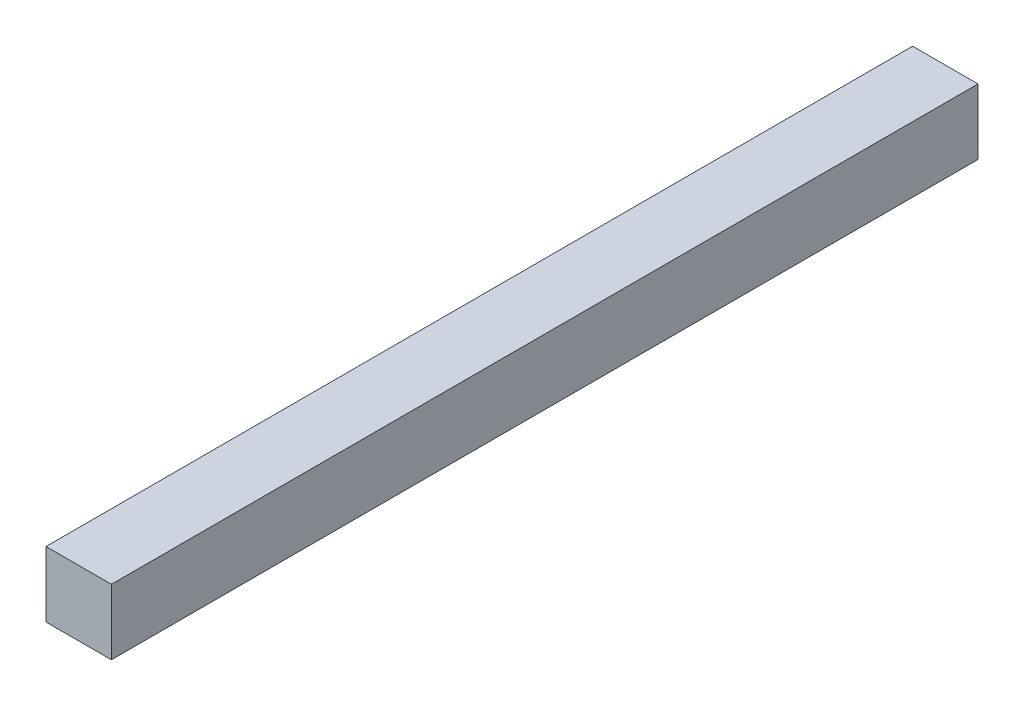
ISO-10303-21;
HEADER;
FILE_DESCRIPTION(('STEP AP214'),'2;1');
FILE_NAME('part.step','',(''),(''),'','','');
FILE_SCHEMA(('AUTOMOTIVE_DESIGN { 1 0 10303 214 1 1 1 1 }'));
ENDSEC;
DATA;
#1=APPLICATION_CONTEXT('core data for automotive mechanical design processes');
#2=APPLICATION_PROTOCOL_DEFINITION('international standard','automotive_design',2000,#1);
#3=PRODUCT_CONTEXT('',#1,'mechanical');
#4=PRODUCT('Part','Part','',(#3));
#5=PRODUCT_RELATED_PRODUCT_CATEGORY('part','',(#4));
#6=PRODUCT_DEFINITION_FORMATION('','',#4);
#7=PRODUCT_DEFINITION_CONTEXT('part definition',#1,'design');
#8=PRODUCT_DEFINITION('design','',#6,#7);
#9=PRODUCT_DEFINITION_SHAPE('','',#8);
#10=(LENGTH_UNIT() NAMED_UNIT(*) SI_UNIT(.MILLI.,.METRE.));
#11=(NAMED_UNIT(*) PLANE_ANGLE_UNIT() SI_UNIT($,.RADIAN.));
#12=(NAMED_UNIT(*) SI_UNIT($,.STERADIAN.) SOLID_ANGLE_UNIT());
#13=UNCERTAINTY_MEASURE_WITH_UNIT(LENGTH_MEASURE(1.E-05),#10,'distance_accuracy_value','');
#14=(GEOMETRIC_REPRESENTATION_CONTEXT(3) GLOBAL_UNCERTAINTY_ASSIGNED_CONTEXT((#13)) GLOBAL_UNIT_ASSIGNED_CONTEXT((#10,
#11,#12)) REPRESENTATION_CONTEXT('',''));
#15=CARTESIAN_POINT('',(0.,0.,0.));
#16=DIRECTION('',(0.,0.,1.));
#17=DIRECTION('',(1.,0.,0.));
#18=AXIS2_PLACEMENT_3D('',#15,#16,#17);
#19=CARTESIAN_POINT('',(10.,-10.,265.));
#20=DIRECTION('',(-1.,0.,0.));
#21=DIRECTION('',(0.,0.,1.));
#22=AXIS2_PLACEMENT_3D('',#19,#20,#21);
#23=PLANE('',#22);
#24=DIRECTION('',(0.,1.,0.));
#25=VECTOR('',#24,1.);
#26=CARTESIAN_POINT('',(10.,-10.,0.));
#27=LINE('',#26,#25);
#28=CARTESIAN_POINT('',(10.,-10.,0.));
#29=VERTEX_POINT('',#28);
#30=CARTESIAN_POINT('',(10.,10.,0.));
#31=VERTEX_POINT('',#30);
#32=EDGE_CURVE('E96',#29,#31,#27,.T.);
#33=ORIENTED_EDGE('',*,*,#32,.T.);
#34=DIRECTION('',(0.,0.,-1.));
#35=VECTOR('',#34,1.);
#36=CARTESIAN_POINT('',(10.,10.,265.));
#37=LINE('',#36,#35);
#38=CARTESIAN_POINT('',(10.,10.,265.));
#39=VERTEX_POINT('',#38);
#40=EDGE_CURVE('E11',#39,#31,#37,.T.);
#41=ORIENTED_EDGE('',*,*,#40,.F.);
#42=DIRECTION('',(0.,1.,0.));
#43=VECTOR('',#42,1.);
#44=CARTESIAN_POINT('',(10.,-10.,265.));
#45=LINE('',#44,#43);
#46=CARTESIAN_POINT('',(10.,-10.,265.));
#47=VERTEX_POINT('',#46);
#48=EDGE_CURVE('E84',#47,#39,#45,.T.);
#49=ORIENTED_EDGE('',*,*,#48,.F.);
#50=DIRECTION('',(0.,0.,-1.));
#51=VECTOR('',#50,1.);
#52=CARTESIAN_POINT('',(10.,-10.,265.));
#53=LINE('',#52,#51);
#54=EDGE_CURVE('E92',#47,#29,#53,.T.);
#55=ORIENTED_EDGE('',*,*,#54,.T.);
#56=EDGE_LOOP('',(#33,#41,#49,#55));
#57=FACE_BOUND('',#56,.T.);
#58=ADVANCED_FACE('F33',(#57),#23,.F.);
#59=CARTESIAN_POINT('',(-10.,10.,265.));
#60=DIRECTION('',(0.,-1.,0.));
#61=DIRECTION('',(0.,0.,-1.));
#62=AXIS2_PLACEMENT_3D('',#59,#60,#61);
#63=PLANE('',#62);
#64=DIRECTION('',(-1.,0.,0.));
#65=VECTOR('',#64,1.);
#66=CARTESIAN_POINT('',(-10.,10.,0.));
#67=LINE('',#66,#65);
#68=CARTESIAN_POINT('',(-10.,10.,0.));
#69=VERTEX_POINT('',#68);
#70=EDGE_CURVE('E88',#31,#69,#67,.T.);
#71=ORIENTED_EDGE('',*,*,#70,.T.);
#72=DIRECTION('',(0.,0.,-1.));
#73=VECTOR('',#72,1.);
#74=CARTESIAN_POINT('',(-10.,10.,265.));
#75=LINE('',#74,#73);
#76=CARTESIAN_POINT('',(-10.,10.,265.));
#77=VERTEX_POINT('',#76);
#78=EDGE_CURVE('E41',#77,#69,#75,.T.);
#79=ORIENTED_EDGE('',*,*,#78,.F.);
#80=DIRECTION('',(-1.,0.,0.));
#81=VECTOR('',#80,1.);
#82=CARTESIAN_POINT('',(-10.,10.,265.));
#83=LINE('',#82,#81);
#84=EDGE_CURVE('E79',#39,#77,#83,.T.);
#85=ORIENTED_EDGE('',*,*,#84,.F.);
#86=ORIENTED_EDGE('',*,*,#40,.T.);
#87=EDGE_LOOP('',(#71,#79,#85,#86));
#88=FACE_BOUND('',#87,.T.);
#89=ADVANCED_FACE('F87',(#88),#63,.F.);
#90=CARTESIAN_POINT('',(-10.,-10.,265.));
#91=DIRECTION('',(1.,0.,0.));
#92=DIRECTION('',(0.,0.,-1.));
#93=AXIS2_PLACEMENT_3D('',#90,#91,#92);
#94=PLANE('',#93);
#95=DIRECTION('',(0.,-1.,0.));
#96=VECTOR('',#95,1.);
#97=CARTESIAN_POINT('',(-10.,-10.,0.));
#98=LINE('',#97,#96);
#99=CARTESIAN_POINT('',(-10.,-10.,0.));
#100=VERTEX_POINT('',#99);
#101=EDGE_CURVE('E66',#69,#100,#98,.T.);
#102=ORIENTED_EDGE('',*,*,#101,.T.);
#103=DIRECTION('',(0.,0.,-1.));
#104=VECTOR('',#103,1.);
#105=CARTESIAN_POINT('',(-10.,-10.,265.));
#106=LINE('',#105,#104);
#107=CARTESIAN_POINT('',(-10.,-10.,265.));
#108=VERTEX_POINT('',#107);
#109=EDGE_CURVE('E89',#108,#100,#106,.T.);
#110=ORIENTED_EDGE('',*,*,#109,.F.);
#111=DIRECTION('',(0.,-1.,0.));
#112=VECTOR('',#111,1.);
#113=CARTESIAN_POINT('',(-10.,-10.,265.));
#114=LINE('',#113,#112);
#115=EDGE_CURVE('E82',#77,#108,#114,.T.);
#116=ORIENTED_EDGE('',*,*,#115,.F.);
#117=ORIENTED_EDGE('',*,*,#78,.T.);
#118=EDGE_LOOP('',(#102,#110,#116,#117));
#119=FACE_BOUND('',#118,.T.);
#120=ADVANCED_FACE('F90',(#119),#94,.F.);
#121=CARTESIAN_POINT('',(-10.,-10.,265.));
#122=DIRECTION('',(0.,1.,0.));
#123=DIRECTION('',(0.,0.,1.));
#124=AXIS2_PLACEMENT_3D('',#121,#122,#123);
#125=PLANE('',#124);
#126=DIRECTION('',(1.,0.,0.));
#127=VECTOR('',#126,1.);
#128=CARTESIAN_POINT('',(-10.,-10.,0.));
#129=LINE('',#128,#127);
#130=EDGE_CURVE('E72',#100,#29,#129,.T.);
#131=ORIENTED_EDGE('',*,*,#130,.T.);
#132=ORIENTED_EDGE('',*,*,#54,.F.);
#133=DIRECTION('',(1.,0.,0.));
#134=VECTOR('',#133,1.);
#135=CARTESIAN_POINT('',(-10.,-10.,265.));
#136=LINE('',#135,#134);
#137=EDGE_CURVE('E49',#108,#47,#136,.T.);
#138=ORIENTED_EDGE('',*,*,#137,.F.);
#139=ORIENTED_EDGE('',*,*,#109,.T.);
#140=EDGE_LOOP('',(#131,#132,#138,#139));
#141=FACE_BOUND('',#140,.T.);
#142=ADVANCED_FACE('F103',(#141),#125,.F.);
#143=CARTESIAN_POINT('',(0.,0.,265.));
#144=DIRECTION('',(0.,0.,-1.));
#145=DIRECTION('',(-1.,0.,0.));
#146=AXIS2_PLACEMENT_3D('',#143,#144,#145);
#147=PLANE('',#146);
#148=ORIENTED_EDGE('',*,*,#48,.T.);
#149=ORIENTED_EDGE('',*,*,#84,.T.);
#150=ORIENTED_EDGE('',*,*,#115,.T.);
#151=ORIENTED_EDGE('',*,*,#137,.T.);
#152=EDGE_LOOP('',(#148,#149,#150,#151));
#153=FACE_BOUND('',#152,.T.);
#154=ADVANCED_FACE('F80',(#153),#147,.F.);
#155=CARTESIAN_POINT('',(0.,0.,0.));
#156=DIRECTION('',(0.,0.,-1.));
#157=DIRECTION('',(-1.,0.,0.));
#158=AXIS2_PLACEMENT_3D('',#155,#156,#157);
#159=PLANE('',#158);
#160=ORIENTED_EDGE('',*,*,#32,.F.);
#161=ORIENTED_EDGE('',*,*,#130,.F.);
#162=ORIENTED_EDGE('',*,*,#101,.F.);
#163=ORIENTED_EDGE('',*,*,#70,.F.);
#164=EDGE_LOOP('',(#160,#161,#162,#163));
#165=FACE_BOUND('',#164,.T.);
#166=ADVANCED_FACE('F106',(#165),#159,.T.);
#167=CLOSED_SHELL('',(#58,#89,#120,#142,#154,#166));
#168=MANIFOLD_SOLID_BREP('B2',#167);
#169=ADVANCED_BREP_SHAPE_REPRESENTATION('',(#18,#168),#14);
#170=SHAPE_DEFINITION_REPRESENTATION(#9,#169);
ENDSEC;
END-ISO-10303-21;
